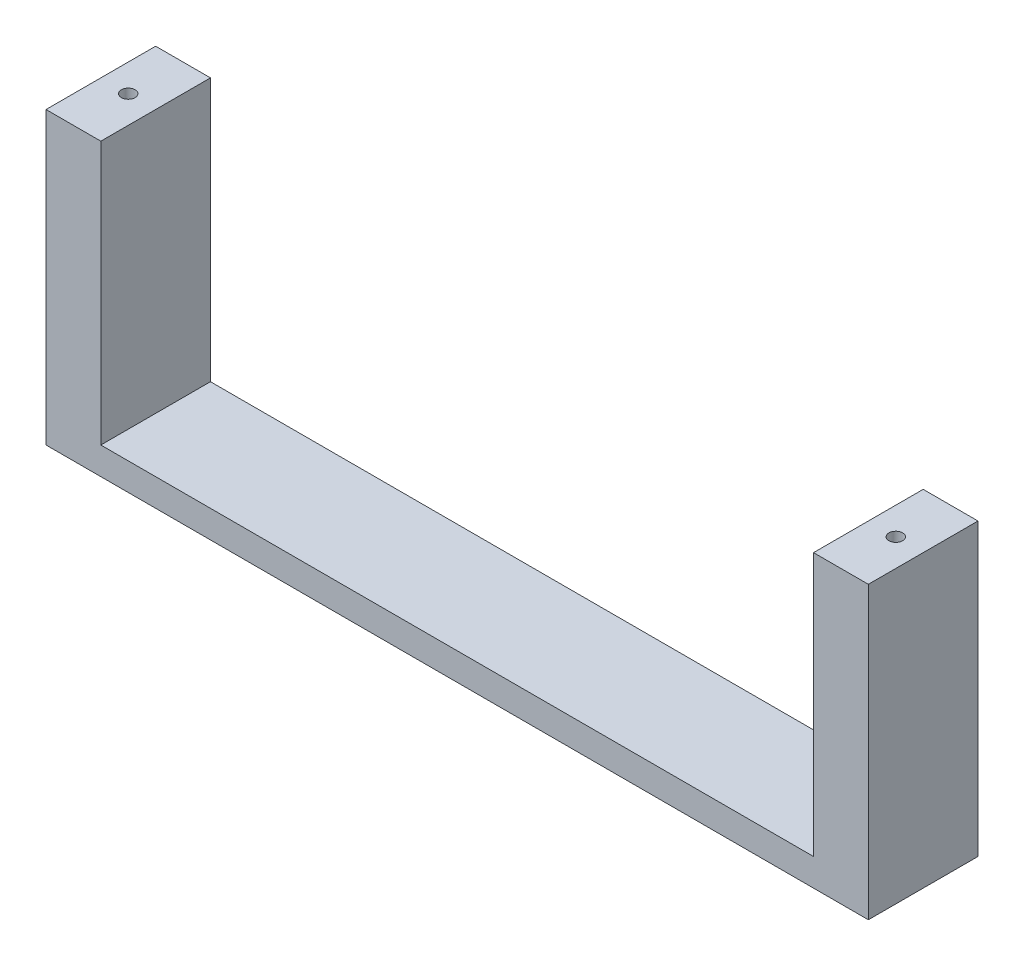
ISO-10303-21;
HEADER;
FILE_DESCRIPTION(('STEP AP214'),'2;1');
FILE_NAME('part.step','',(''),(''),'','','');
FILE_SCHEMA(('AUTOMOTIVE_DESIGN { 1 0 10303 214 1 1 1 1 }'));
ENDSEC;
DATA;
#1=APPLICATION_CONTEXT('core data for automotive mechanical design processes');
#2=APPLICATION_PROTOCOL_DEFINITION('international standard','automotive_design',2000,#1);
#3=PRODUCT_CONTEXT('',#1,'mechanical');
#4=PRODUCT('Part','Part','',(#3));
#5=PRODUCT_RELATED_PRODUCT_CATEGORY('part','',(#4));
#6=PRODUCT_DEFINITION_FORMATION('','',#4);
#7=PRODUCT_DEFINITION_CONTEXT('part definition',#1,'design');
#8=PRODUCT_DEFINITION('design','',#6,#7);
#9=PRODUCT_DEFINITION_SHAPE('','',#8);
#10=(LENGTH_UNIT() NAMED_UNIT(*) SI_UNIT(.MILLI.,.METRE.));
#11=(NAMED_UNIT(*) PLANE_ANGLE_UNIT() SI_UNIT($,.RADIAN.));
#12=(NAMED_UNIT(*) SI_UNIT($,.STERADIAN.) SOLID_ANGLE_UNIT());
#13=UNCERTAINTY_MEASURE_WITH_UNIT(LENGTH_MEASURE(1.E-05),#10,'distance_accuracy_value','');
#14=(GEOMETRIC_REPRESENTATION_CONTEXT(3) GLOBAL_UNCERTAINTY_ASSIGNED_CONTEXT((#13)) GLOBAL_UNIT_ASSIGNED_CONTEXT((#10,
#11,#12)) REPRESENTATION_CONTEXT('',''));
#15=CARTESIAN_POINT('',(0.,0.,0.));
#16=DIRECTION('',(0.,0.,1.));
#17=DIRECTION('',(1.,0.,0.));
#18=AXIS2_PLACEMENT_3D('',#15,#16,#17);
#19=CARTESIAN_POINT('',(0.,5.,0.));
#20=DIRECTION('',(0.,1.,0.));
#21=DIRECTION('',(0.,0.,1.));
#22=AXIS2_PLACEMENT_3D('',#19,#20,#21);
#23=PLANE('',#22);
#24=DIRECTION('',(-1.,0.,0.));
#25=VECTOR('',#24,1.);
#26=CARTESIAN_POINT('',(75.,5.,-10.));
#27=LINE('',#26,#25);
#28=CARTESIAN_POINT('',(65.,5.,-10.));
#29=VERTEX_POINT('',#28);
#30=CARTESIAN_POINT('',(-65.,5.,-9.99999999999999));
#31=VERTEX_POINT('',#30);
#32=EDGE_CURVE('E59',#29,#31,#27,.T.);
#33=ORIENTED_EDGE('',*,*,#32,.T.);
#34=DIRECTION('',(0.,0.,-1.));
#35=VECTOR('',#34,1.);
#36=CARTESIAN_POINT('',(-65.,5.,-9.99999999999999));
#37=LINE('',#36,#35);
#38=CARTESIAN_POINT('',(-65.,5.,10.));
#39=VERTEX_POINT('',#38);
#40=EDGE_CURVE('E54',#39,#31,#37,.T.);
#41=ORIENTED_EDGE('',*,*,#40,.F.);
#42=DIRECTION('',(1.,0.,0.));
#43=VECTOR('',#42,1.);
#44=CARTESIAN_POINT('',(75.,5.,9.99999999999999));
#45=LINE('',#44,#43);
#46=CARTESIAN_POINT('',(65.,5.,10.));
#47=VERTEX_POINT('',#46);
#48=EDGE_CURVE('E168',#39,#47,#45,.T.);
#49=ORIENTED_EDGE('',*,*,#48,.T.);
#50=DIRECTION('',(0.,0.,1.));
#51=VECTOR('',#50,1.);
#52=CARTESIAN_POINT('',(65.,5.,-10.));
#53=LINE('',#52,#51);
#54=EDGE_CURVE('E142',#29,#47,#53,.T.);
#55=ORIENTED_EDGE('',*,*,#54,.F.);
#56=EDGE_LOOP('',(#33,#41,#49,#55));
#57=FACE_BOUND('',#56,.T.);
#58=ADVANCED_FACE('F38',(#57),#23,.T.);
#59=CARTESIAN_POINT('',(-75.,5.,10.));
#60=DIRECTION('',(1.,0.,0.));
#61=DIRECTION('',(0.,0.,-1.));
#62=AXIS2_PLACEMENT_3D('',#59,#60,#61);
#63=PLANE('',#62);
#64=DIRECTION('',(0.,0.,1.));
#65=VECTOR('',#64,1.);
#66=CARTESIAN_POINT('',(-75.,0.,10.));
#67=LINE('',#66,#65);
#68=CARTESIAN_POINT('',(-75.,0.,-9.99999999999999));
#69=VERTEX_POINT('',#68);
#70=CARTESIAN_POINT('',(-75.,0.,10.));
#71=VERTEX_POINT('',#70);
#72=EDGE_CURVE('E107',#69,#71,#67,.T.);
#73=ORIENTED_EDGE('',*,*,#72,.T.);
#74=DIRECTION('',(0.,-1.,0.));
#75=VECTOR('',#74,1.);
#76=CARTESIAN_POINT('',(-75.,5.,10.));
#77=LINE('',#76,#75);
#78=CARTESIAN_POINT('',(-75.,53.,10.));
#79=VERTEX_POINT('',#78);
#80=EDGE_CURVE('E11',#79,#71,#77,.T.);
#81=ORIENTED_EDGE('',*,*,#80,.F.);
#82=DIRECTION('',(0.,0.,1.));
#83=VECTOR('',#82,1.);
#84=CARTESIAN_POINT('',(-75.,53.,-9.99999999999999));
#85=LINE('',#84,#83);
#86=CARTESIAN_POINT('',(-75.,53.,-9.99999999999999));
#87=VERTEX_POINT('',#86);
#88=EDGE_CURVE('E105',#87,#79,#85,.T.);
#89=ORIENTED_EDGE('',*,*,#88,.F.);
#90=DIRECTION('',(0.,-1.,0.));
#91=VECTOR('',#90,1.);
#92=CARTESIAN_POINT('',(-75.,5.,-9.99999999999999));
#93=LINE('',#92,#91);
#94=EDGE_CURVE('E174',#87,#69,#93,.T.);
#95=ORIENTED_EDGE('',*,*,#94,.T.);
#96=EDGE_LOOP('',(#73,#81,#89,#95));
#97=FACE_BOUND('',#96,.T.);
#98=ADVANCED_FACE('F40',(#97),#63,.F.);
#99=CARTESIAN_POINT('',(75.,5.,9.99999999999999));
#100=DIRECTION('',(0.,0.,-1.));
#101=DIRECTION('',(-1.,0.,0.));
#102=AXIS2_PLACEMENT_3D('',#99,#100,#101);
#103=PLANE('',#102);
#104=DIRECTION('',(1.,0.,0.));
#105=VECTOR('',#104,1.);
#106=CARTESIAN_POINT('',(75.,0.,9.99999999999999));
#107=LINE('',#106,#105);
#108=CARTESIAN_POINT('',(75.,0.,9.99999999999999));
#109=VERTEX_POINT('',#108);
#110=EDGE_CURVE('E177',#71,#109,#107,.T.);
#111=ORIENTED_EDGE('',*,*,#110,.T.);
#112=DIRECTION('',(0.,-1.,0.));
#113=VECTOR('',#112,1.);
#114=CARTESIAN_POINT('',(75.,5.,9.99999999999999));
#115=LINE('',#114,#113);
#116=CARTESIAN_POINT('',(75.,53.,10.));
#117=VERTEX_POINT('',#116);
#118=EDGE_CURVE('E47',#117,#109,#115,.T.);
#119=ORIENTED_EDGE('',*,*,#118,.F.);
#120=DIRECTION('',(1.,0.,0.));
#121=VECTOR('',#120,1.);
#122=CARTESIAN_POINT('',(75.,53.,10.));
#123=LINE('',#122,#121);
#124=CARTESIAN_POINT('',(65.,53.,10.));
#125=VERTEX_POINT('',#124);
#126=EDGE_CURVE('E153',#125,#117,#123,.T.);
#127=ORIENTED_EDGE('',*,*,#126,.F.);
#128=DIRECTION('',(0.,-1.,0.));
#129=VECTOR('',#128,1.);
#130=CARTESIAN_POINT('',(65.,53.,10.));
#131=LINE('',#130,#129);
#132=EDGE_CURVE('E157',#125,#47,#131,.T.);
#133=ORIENTED_EDGE('',*,*,#132,.T.);
#134=ORIENTED_EDGE('',*,*,#48,.F.);
#135=DIRECTION('',(0.,-1.,0.));
#136=VECTOR('',#135,1.);
#137=CARTESIAN_POINT('',(-65.,53.,10.));
#138=LINE('',#137,#136);
#139=CARTESIAN_POINT('',(-65.,53.,10.));
#140=VERTEX_POINT('',#139);
#141=EDGE_CURVE('E113',#140,#39,#138,.T.);
#142=ORIENTED_EDGE('',*,*,#141,.F.);
#143=DIRECTION('',(1.,0.,0.));
#144=VECTOR('',#143,1.);
#145=CARTESIAN_POINT('',(-75.,53.,10.));
#146=LINE('',#145,#144);
#147=EDGE_CURVE('E110',#79,#140,#146,.T.);
#148=ORIENTED_EDGE('',*,*,#147,.F.);
#149=ORIENTED_EDGE('',*,*,#80,.T.);
#150=EDGE_LOOP('',(#111,#119,#127,#133,#134,#142,#148,#149));
#151=FACE_BOUND('',#150,.T.);
#152=ADVANCED_FACE('F111',(#151),#103,.F.);
#153=CARTESIAN_POINT('',(75.,5.,9.99999999999999));
#154=DIRECTION('',(-1.,0.,0.));
#155=DIRECTION('',(0.,0.,1.));
#156=AXIS2_PLACEMENT_3D('',#153,#154,#155);
#157=PLANE('',#156);
#158=DIRECTION('',(0.,0.,-1.));
#159=VECTOR('',#158,1.);
#160=CARTESIAN_POINT('',(75.,0.,9.99999999999999));
#161=LINE('',#160,#159);
#162=CARTESIAN_POINT('',(75.,0.,-10.));
#163=VERTEX_POINT('',#162);
#164=EDGE_CURVE('E180',#109,#163,#161,.T.);
#165=ORIENTED_EDGE('',*,*,#164,.T.);
#166=DIRECTION('',(0.,-1.,0.));
#167=VECTOR('',#166,1.);
#168=CARTESIAN_POINT('',(75.,5.,-10.));
#169=LINE('',#168,#167);
#170=CARTESIAN_POINT('',(75.,53.,-10.));
#171=VERTEX_POINT('',#170);
#172=EDGE_CURVE('E187',#171,#163,#169,.T.);
#173=ORIENTED_EDGE('',*,*,#172,.F.);
#174=DIRECTION('',(0.,0.,-1.));
#175=VECTOR('',#174,1.);
#176=CARTESIAN_POINT('',(75.,53.,-10.));
#177=LINE('',#176,#175);
#178=EDGE_CURVE('E143',#117,#171,#177,.T.);
#179=ORIENTED_EDGE('',*,*,#178,.F.);
#180=ORIENTED_EDGE('',*,*,#118,.T.);
#181=EDGE_LOOP('',(#165,#173,#179,#180));
#182=FACE_BOUND('',#181,.T.);
#183=ADVANCED_FACE('F195',(#182),#157,.F.);
#184=CARTESIAN_POINT('',(75.,5.,-10.));
#185=DIRECTION('',(0.,0.,1.));
#186=DIRECTION('',(1.,0.,0.));
#187=AXIS2_PLACEMENT_3D('',#184,#185,#186);
#188=PLANE('',#187);
#189=DIRECTION('',(-1.,0.,0.));
#190=VECTOR('',#189,1.);
#191=CARTESIAN_POINT('',(75.,0.,-10.));
#192=LINE('',#191,#190);
#193=EDGE_CURVE('E171',#163,#69,#192,.T.);
#194=ORIENTED_EDGE('',*,*,#193,.T.);
#195=ORIENTED_EDGE('',*,*,#94,.F.);
#196=DIRECTION('',(-1.,0.,0.));
#197=VECTOR('',#196,1.);
#198=CARTESIAN_POINT('',(-75.,53.,-9.99999999999999));
#199=LINE('',#198,#197);
#200=CARTESIAN_POINT('',(-65.,53.,-9.99999999999999));
#201=VERTEX_POINT('',#200);
#202=EDGE_CURVE('E122',#201,#87,#199,.T.);
#203=ORIENTED_EDGE('',*,*,#202,.F.);
#204=DIRECTION('',(0.,-1.,0.));
#205=VECTOR('',#204,1.);
#206=CARTESIAN_POINT('',(-65.,53.,-9.99999999999999));
#207=LINE('',#206,#205);
#208=EDGE_CURVE('E135',#201,#31,#207,.T.);
#209=ORIENTED_EDGE('',*,*,#208,.T.);
#210=ORIENTED_EDGE('',*,*,#32,.F.);
#211=DIRECTION('',(0.,-1.,0.));
#212=VECTOR('',#211,1.);
#213=CARTESIAN_POINT('',(65.,53.,-10.));
#214=LINE('',#213,#212);
#215=CARTESIAN_POINT('',(65.,53.,-10.));
#216=VERTEX_POINT('',#215);
#217=EDGE_CURVE('E164',#216,#29,#214,.T.);
#218=ORIENTED_EDGE('',*,*,#217,.F.);
#219=DIRECTION('',(-1.,0.,0.));
#220=VECTOR('',#219,1.);
#221=CARTESIAN_POINT('',(75.,53.,-10.));
#222=LINE('',#221,#220);
#223=EDGE_CURVE('E147',#171,#216,#222,.T.);
#224=ORIENTED_EDGE('',*,*,#223,.F.);
#225=ORIENTED_EDGE('',*,*,#172,.T.);
#226=EDGE_LOOP('',(#194,#195,#203,#209,#210,#218,#224,#225));
#227=FACE_BOUND('',#226,.T.);
#228=ADVANCED_FACE('F201',(#227),#188,.F.);
#229=CARTESIAN_POINT('',(0.,0.,0.));
#230=DIRECTION('',(0.,1.,0.));
#231=DIRECTION('',(0.,0.,1.));
#232=AXIS2_PLACEMENT_3D('',#229,#230,#231);
#233=PLANE('',#232);
#234=ORIENTED_EDGE('',*,*,#72,.F.);
#235=ORIENTED_EDGE('',*,*,#193,.F.);
#236=ORIENTED_EDGE('',*,*,#164,.F.);
#237=ORIENTED_EDGE('',*,*,#110,.F.);
#238=EDGE_LOOP('',(#234,#235,#236,#237));
#239=FACE_BOUND('',#238,.T.);
#240=ADVANCED_FACE('F199',(#239),#233,.F.);
#241=CARTESIAN_POINT('',(65.,53.,-10.));
#242=DIRECTION('',(1.,0.,0.));
#243=DIRECTION('',(0.,0.,-1.));
#244=AXIS2_PLACEMENT_3D('',#241,#242,#243);
#245=PLANE('',#244);
#246=ORIENTED_EDGE('',*,*,#54,.T.);
#247=ORIENTED_EDGE('',*,*,#132,.F.);
#248=DIRECTION('',(0.,0.,1.));
#249=VECTOR('',#248,1.);
#250=CARTESIAN_POINT('',(65.,53.,-10.));
#251=LINE('',#250,#249);
#252=EDGE_CURVE('E150',#216,#125,#251,.T.);
#253=ORIENTED_EDGE('',*,*,#252,.F.);
#254=ORIENTED_EDGE('',*,*,#217,.T.);
#255=EDGE_LOOP('',(#246,#247,#253,#254));
#256=FACE_BOUND('',#255,.T.);
#257=ADVANCED_FACE('F209',(#256),#245,.F.);
#258=CARTESIAN_POINT('',(0.,53.,0.));
#259=DIRECTION('',(0.,-1.,0.));
#260=DIRECTION('',(0.,0.,-1.));
#261=AXIS2_PLACEMENT_3D('',#258,#259,#260);
#262=PLANE('',#261);
#263=CARTESIAN_POINT('',(70.,53.,0.));
#264=DIRECTION('',(0.,1.,0.));
#265=DIRECTION('',(0.,0.,1.));
#266=AXIS2_PLACEMENT_3D('',#263,#264,#265);
#267=CIRCLE('',#266,1.25);
#268=CARTESIAN_POINT('',(70.,53.,1.25));
#269=VERTEX_POINT('',#268);
#270=EDGE_CURVE('E314',#269,#269,#267,.T.);
#271=ORIENTED_EDGE('',*,*,#270,.F.);
#272=EDGE_LOOP('',(#271));
#273=FACE_BOUND('',#272,.T.);
#274=ORIENTED_EDGE('',*,*,#178,.T.);
#275=ORIENTED_EDGE('',*,*,#223,.T.);
#276=ORIENTED_EDGE('',*,*,#252,.T.);
#277=ORIENTED_EDGE('',*,*,#126,.T.);
#278=EDGE_LOOP('',(#274,#275,#276,#277));
#279=FACE_BOUND('',#278,.T.);
#280=ADVANCED_FACE('F206',(#273,#279),#262,.F.);
#281=CARTESIAN_POINT('',(-65.,53.,-9.99999999999999));
#282=DIRECTION('',(-1.,0.,0.));
#283=DIRECTION('',(0.,0.,1.));
#284=AXIS2_PLACEMENT_3D('',#281,#282,#283);
#285=PLANE('',#284);
#286=ORIENTED_EDGE('',*,*,#40,.T.);
#287=ORIENTED_EDGE('',*,*,#208,.F.);
#288=DIRECTION('',(0.,0.,-1.));
#289=VECTOR('',#288,1.);
#290=CARTESIAN_POINT('',(-65.,53.,-9.99999999999999));
#291=LINE('',#290,#289);
#292=EDGE_CURVE('E117',#140,#201,#291,.T.);
#293=ORIENTED_EDGE('',*,*,#292,.F.);
#294=ORIENTED_EDGE('',*,*,#141,.T.);
#295=EDGE_LOOP('',(#286,#287,#293,#294));
#296=FACE_BOUND('',#295,.T.);
#297=ADVANCED_FACE('F212',(#296),#285,.F.);
#298=CARTESIAN_POINT('',(0.,53.,0.));
#299=DIRECTION('',(0.,1.,0.));
#300=DIRECTION('',(0.,0.,1.));
#301=AXIS2_PLACEMENT_3D('',#298,#299,#300);
#302=PLANE('',#301);
#303=CARTESIAN_POINT('',(-70.,53.,0.));
#304=DIRECTION('',(0.,1.,0.));
#305=DIRECTION('',(0.,0.,1.));
#306=AXIS2_PLACEMENT_3D('',#303,#304,#305);
#307=CIRCLE('',#306,1.25);
#308=CARTESIAN_POINT('',(-70.,53.,1.25000000000002));
#309=VERTEX_POINT('',#308);
#310=EDGE_CURVE('E129',#309,#309,#307,.T.);
#311=ORIENTED_EDGE('',*,*,#310,.F.);
#312=EDGE_LOOP('',(#311));
#313=FACE_BOUND('',#312,.T.);
#314=ORIENTED_EDGE('',*,*,#88,.T.);
#315=ORIENTED_EDGE('',*,*,#147,.T.);
#316=ORIENTED_EDGE('',*,*,#292,.T.);
#317=ORIENTED_EDGE('',*,*,#202,.T.);
#318=EDGE_LOOP('',(#314,#315,#316,#317));
#319=FACE_BOUND('',#318,.T.);
#320=ADVANCED_FACE('F120',(#313,#319),#302,.T.);
#321=CARTESIAN_POINT('',(-70.,43.,0.));
#322=DIRECTION('',(0.,1.,0.));
#323=DIRECTION('',(0.,0.,1.));
#324=AXIS2_PLACEMENT_3D('',#321,#322,#323);
#325=CYLINDRICAL_SURFACE('',#324,1.25);
#326=CARTESIAN_POINT('',(-70.,43.,0.));
#327=DIRECTION('',(0.,1.,0.));
#328=DIRECTION('',(0.,0.,1.));
#329=AXIS2_PLACEMENT_3D('',#326,#327,#328);
#330=CIRCLE('',#329,1.25);
#331=CARTESIAN_POINT('',(-70.,43.,1.25000000000002));
#332=VERTEX_POINT('',#331);
#333=EDGE_CURVE('E318',#332,#332,#330,.T.);
#334=ORIENTED_EDGE('',*,*,#333,.F.);
#335=EDGE_LOOP('',(#334));
#336=FACE_BOUND('',#335,.T.);
#337=ORIENTED_EDGE('',*,*,#310,.T.);
#338=EDGE_LOOP('',(#337));
#339=FACE_BOUND('',#338,.T.);
#340=ADVANCED_FACE('F220',(#336,#339),#325,.F.);
#341=CARTESIAN_POINT('',(-70.,43.,0.));
#342=DIRECTION('',(0.,1.,0.));
#343=DIRECTION('',(0.,0.,1.));
#344=AXIS2_PLACEMENT_3D('',#341,#342,#343);
#345=PLANE('',#344);
#346=ORIENTED_EDGE('',*,*,#333,.T.);
#347=EDGE_LOOP('',(#346));
#348=FACE_BOUND('',#347,.T.);
#349=ADVANCED_FACE('F277',(#348),#345,.T.);
#350=CARTESIAN_POINT('',(70.,43.,0.));
#351=DIRECTION('',(0.,1.,0.));
#352=DIRECTION('',(0.,0.,1.));
#353=AXIS2_PLACEMENT_3D('',#350,#351,#352);
#354=CYLINDRICAL_SURFACE('',#353,1.25);
#355=CARTESIAN_POINT('',(70.,43.,0.));
#356=DIRECTION('',(0.,1.,0.));
#357=DIRECTION('',(0.,0.,1.));
#358=AXIS2_PLACEMENT_3D('',#355,#356,#357);
#359=CIRCLE('',#358,1.25);
#360=CARTESIAN_POINT('',(70.,43.,1.25));
#361=VERTEX_POINT('',#360);
#362=EDGE_CURVE('E126',#361,#361,#359,.T.);
#363=ORIENTED_EDGE('',*,*,#362,.F.);
#364=EDGE_LOOP('',(#363));
#365=FACE_BOUND('',#364,.T.);
#366=ORIENTED_EDGE('',*,*,#270,.T.);
#367=EDGE_LOOP('',(#366));
#368=FACE_BOUND('',#367,.T.);
#369=ADVANCED_FACE('F287',(#365,#368),#354,.F.);
#370=CARTESIAN_POINT('',(70.,43.,0.));
#371=DIRECTION('',(0.,1.,0.));
#372=DIRECTION('',(0.,0.,1.));
#373=AXIS2_PLACEMENT_3D('',#370,#371,#372);
#374=PLANE('',#373);
#375=ORIENTED_EDGE('',*,*,#362,.T.);
#376=EDGE_LOOP('',(#375));
#377=FACE_BOUND('',#376,.T.);
#378=ADVANCED_FACE('F297',(#377),#374,.T.);
#379=CLOSED_SHELL('',(#58,#98,#152,#183,#228,#240,#257,#280,#297,#320,#340,#349,#369,#378));
#380=MANIFOLD_SOLID_BREP('B2',#379);
#381=ADVANCED_BREP_SHAPE_REPRESENTATION('',(#18,#380),#14);
#382=SHAPE_DEFINITION_REPRESENTATION(#9,#381);
ENDSEC;
END-ISO-10303-21;
